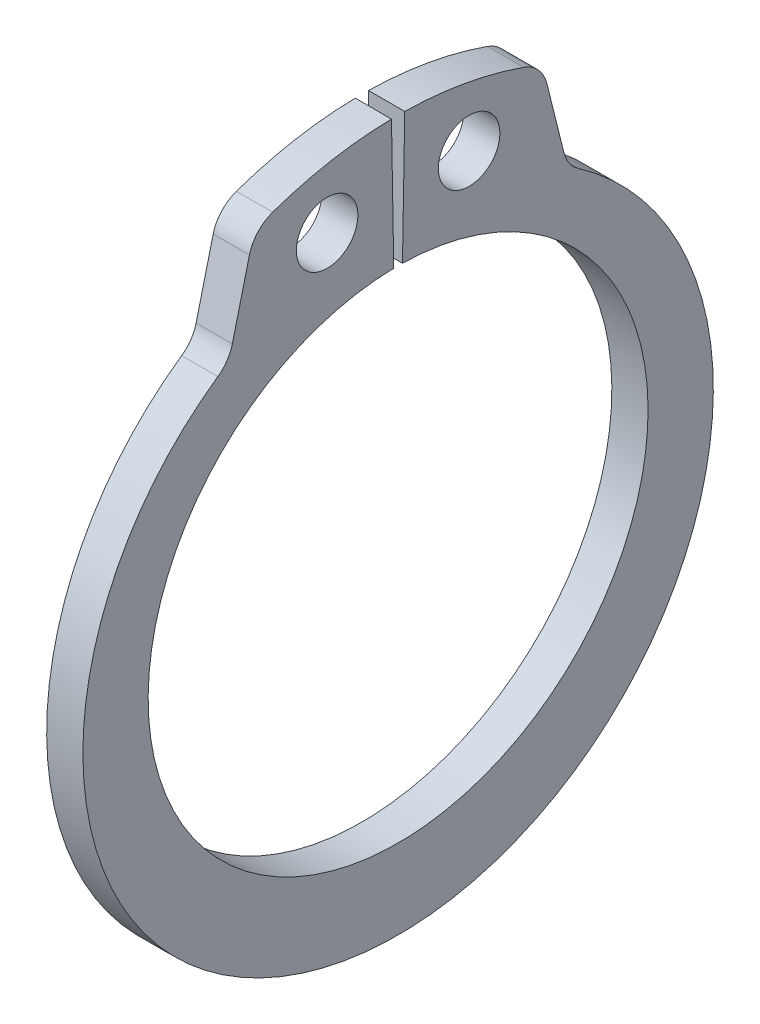
ISO-10303-21;
HEADER;
FILE_DESCRIPTION(('STEP AP214'),'2;1');
FILE_NAME('part.step','',(''),(''),'','','');
FILE_SCHEMA(('AUTOMOTIVE_DESIGN { 1 0 10303 214 1 1 1 1 }'));
ENDSEC;
DATA;
#1=APPLICATION_CONTEXT('core data for automotive mechanical design processes');
#2=APPLICATION_PROTOCOL_DEFINITION('international standard','automotive_design',2000,#1);
#3=PRODUCT_CONTEXT('',#1,'mechanical');
#4=PRODUCT('Part','Part','',(#3));
#5=PRODUCT_RELATED_PRODUCT_CATEGORY('part','',(#4));
#6=PRODUCT_DEFINITION_FORMATION('','',#4);
#7=PRODUCT_DEFINITION_CONTEXT('part definition',#1,'design');
#8=PRODUCT_DEFINITION('design','',#6,#7);
#9=PRODUCT_DEFINITION_SHAPE('','',#8);
#10=(LENGTH_UNIT() NAMED_UNIT(*) SI_UNIT(.MILLI.,.METRE.));
#11=(NAMED_UNIT(*) PLANE_ANGLE_UNIT() SI_UNIT($,.RADIAN.));
#12=(NAMED_UNIT(*) SI_UNIT($,.STERADIAN.) SOLID_ANGLE_UNIT());
#13=UNCERTAINTY_MEASURE_WITH_UNIT(LENGTH_MEASURE(1.E-05),#10,'distance_accuracy_value','');
#14=(GEOMETRIC_REPRESENTATION_CONTEXT(3) GLOBAL_UNCERTAINTY_ASSIGNED_CONTEXT((#13)) GLOBAL_UNIT_ASSIGNED_CONTEXT((#10,
#11,#12)) REPRESENTATION_CONTEXT('',''));
#15=CARTESIAN_POINT('',(0.,0.,0.));
#16=DIRECTION('',(0.,0.,1.));
#17=DIRECTION('',(1.,0.,0.));
#18=AXIS2_PLACEMENT_3D('',#15,#16,#17);
#19=CARTESIAN_POINT('',(0.5,0.,0.));
#20=DIRECTION('',(1.,0.,0.));
#21=DIRECTION('',(0.,0.,-1.));
#22=AXIS2_PLACEMENT_3D('',#19,#20,#21);
#23=PLANE('',#22);
#24=CARTESIAN_POINT('',(0.5,8.66711980549086,1.9596288316201));
#25=DIRECTION('',(1.,0.,0.));
#26=DIRECTION('',(0.,0.,-1.));
#27=AXIS2_PLACEMENT_3D('',#24,#25,#26);
#28=CIRCLE('',#27,0.85);
#29=CARTESIAN_POINT('',(0.5,8.66711980549086,1.1096288316201));
#30=VERTEX_POINT('',#29);
#31=EDGE_CURVE('E217',#30,#30,#28,.T.);
#32=ORIENTED_EDGE('',*,*,#31,.F.);
#33=EDGE_LOOP('',(#32));
#34=FACE_BOUND('',#33,.T.);
#35=CARTESIAN_POINT('',(0.5,0.,0.));
#36=DIRECTION('',(1.,0.,0.));
#37=DIRECTION('',(0.,0.,-1.));
#38=AXIS2_PLACEMENT_3D('',#35,#36,#37);
#39=CIRCLE('',#38,10.5);
#40=CARTESIAN_POINT('',(0.5,10.4984007991421,0.183250267591477));
#41=VERTEX_POINT('',#40);
#42=CARTESIAN_POINT('',(0.5,9.91217887924345,3.4639153953121));
#43=VERTEX_POINT('',#42);
#44=EDGE_CURVE('E134',#41,#43,#39,.T.);
#45=ORIENTED_EDGE('',*,*,#44,.T.);
#46=CARTESIAN_POINT('',(0.5,8.96816184312502,3.13401869099666));
#47=DIRECTION('',(1.,0.,0.));
#48=DIRECTION('',(0.,0.,-1.));
#49=AXIS2_PLACEMENT_3D('',#46,#47,#48);
#50=CIRCLE('',#49,1.);
#51=CARTESIAN_POINT('',(0.5,9.21008373872468,4.10431441727266));
#52=VERTEX_POINT('',#51);
#53=EDGE_CURVE('E171',#43,#52,#50,.T.);
#54=ORIENTED_EDGE('',*,*,#53,.T.);
#55=DIRECTION('',(0.,-0.970295726275997,0.241921895599665));
#56=VECTOR('',#55,1.);
#57=CARTESIAN_POINT('',(0.5,9.71734472745919,3.97784004803123));
#58=LINE('',#57,#56);
#59=CARTESIAN_POINT('',(0.5,7.31761530924591,4.57615979123836));
#60=VERTEX_POINT('',#59);
#61=EDGE_CURVE('E209',#52,#60,#58,.T.);
#62=ORIENTED_EDGE('',*,*,#61,.T.);
#63=CARTESIAN_POINT('',(0.5,7.55953720484557,5.54645551751436));
#64=DIRECTION('',(1.,0.,0.));
#65=DIRECTION('',(0.,0.,-1.));
#66=AXIS2_PLACEMENT_3D('',#63,#64,#65);
#67=CIRCLE('',#66,1.);
#68=CARTESIAN_POINT('',(0.5,6.73911195964233,4.97470170945254));
#69=VERTEX_POINT('',#68);
#70=EDGE_CURVE('E182',#60,#69,#67,.F.);
#71=ORIENTED_EDGE('',*,*,#70,.T.);
#72=CARTESIAN_POINT('',(0.5,-0.399224177769538,0.));
#73=DIRECTION('',(1.,0.,0.));
#74=DIRECTION('',(0.,0.,-1.));
#75=AXIS2_PLACEMENT_3D('',#72,#73,#74);
#76=CIRCLE('',#75,8.70077582223046);
#77=CARTESIAN_POINT('',(0.5,6.73911195964233,-4.97470170945253));
#78=VERTEX_POINT('',#77);
#79=EDGE_CURVE('E204',#69,#78,#76,.T.);
#80=ORIENTED_EDGE('',*,*,#79,.T.);
#81=CARTESIAN_POINT('',(0.5,7.55953720484557,-5.54645551751436));
#82=DIRECTION('',(1.,0.,0.));
#83=DIRECTION('',(0.,0.,-1.));
#84=AXIS2_PLACEMENT_3D('',#81,#82,#83);
#85=CIRCLE('',#84,1.);
#86=CARTESIAN_POINT('',(0.5,7.31761530924591,-4.57615979123836));
#87=VERTEX_POINT('',#86);
#88=EDGE_CURVE('E11',#78,#87,#85,.F.);
#89=ORIENTED_EDGE('',*,*,#88,.T.);
#90=DIRECTION('',(0.,0.970295726275997,0.241921895599664));
#91=VECTOR('',#90,1.);
#92=CARTESIAN_POINT('',(0.5,9.71734472745919,-3.97784004803123));
#93=LINE('',#92,#91);
#94=CARTESIAN_POINT('',(0.5,9.21008373872468,-4.10431441727266));
#95=VERTEX_POINT('',#94);
#96=EDGE_CURVE('E203',#87,#95,#93,.T.);
#97=ORIENTED_EDGE('',*,*,#96,.T.);
#98=CARTESIAN_POINT('',(0.5,8.96816184312502,-3.13401869099666));
#99=DIRECTION('',(1.,0.,0.));
#100=DIRECTION('',(0.,0.,-1.));
#101=AXIS2_PLACEMENT_3D('',#98,#99,#100);
#102=CIRCLE('',#101,1.);
#103=CARTESIAN_POINT('',(0.5,9.91217887924345,-3.4639153953121));
#104=VERTEX_POINT('',#103);
#105=EDGE_CURVE('E49',#95,#104,#102,.T.);
#106=ORIENTED_EDGE('',*,*,#105,.T.);
#107=CARTESIAN_POINT('',(0.5,0.,0.));
#108=DIRECTION('',(1.,0.,0.));
#109=DIRECTION('',(0.,0.,1.));
#110=AXIS2_PLACEMENT_3D('',#107,#108,#109);
#111=CIRCLE('',#110,10.5);
#112=CARTESIAN_POINT('',(0.5,10.4984007991421,-0.183250267591481));
#113=VERTEX_POINT('',#112);
#114=EDGE_CURVE('E206',#104,#113,#111,.T.);
#115=ORIENTED_EDGE('',*,*,#114,.T.);
#116=DIRECTION('',(0.,-0.999847695156391,0.0174524064372843));
#117=VECTOR('',#116,1.);
#118=CARTESIAN_POINT('',(0.5,10.4984007991421,-0.18325026759148));
#119=LINE('',#118,#117);
#120=CARTESIAN_POINT('',(0.5,6.8989490965791,-0.120421604417257));
#121=VERTEX_POINT('',#120);
#122=EDGE_CURVE('E140',#113,#121,#119,.T.);
#123=ORIENTED_EDGE('',*,*,#122,.T.);
#124=CARTESIAN_POINT('',(0.5,0.,0.));
#125=DIRECTION('',(-1.,0.,0.));
#126=DIRECTION('',(0.,0.,-1.));
#127=AXIS2_PLACEMENT_3D('',#124,#125,#126);
#128=CIRCLE('',#127,6.9);
#129=CARTESIAN_POINT('',(0.5,6.8989490965791,0.120421604417257));
#130=VERTEX_POINT('',#129);
#131=EDGE_CURVE('E135',#121,#130,#128,.T.);
#132=ORIENTED_EDGE('',*,*,#131,.T.);
#133=DIRECTION('',(0.,0.999847695156391,0.0174524064372835));
#134=VECTOR('',#133,1.);
#135=CARTESIAN_POINT('',(0.5,6.8989490965791,0.120421604417257));
#136=LINE('',#135,#134);
#137=EDGE_CURVE('E124',#130,#41,#136,.T.);
#138=ORIENTED_EDGE('',*,*,#137,.T.);
#139=EDGE_LOOP('',(#45,#54,#62,#71,#80,#89,#97,#106,#115,#123,#132,#138));
#140=FACE_BOUND('',#139,.T.);
#141=CARTESIAN_POINT('',(0.5,8.66711980549086,-1.9596288316201));
#142=DIRECTION('',(1.,0.,0.));
#143=DIRECTION('',(0.,0.,-1.));
#144=AXIS2_PLACEMENT_3D('',#141,#142,#143);
#145=CIRCLE('',#144,0.85);
#146=CARTESIAN_POINT('',(0.5,8.66711980549086,-2.8096288316201));
#147=VERTEX_POINT('',#146);
#148=EDGE_CURVE('E246',#147,#147,#145,.T.);
#149=ORIENTED_EDGE('',*,*,#148,.F.);
#150=EDGE_LOOP('',(#149));
#151=FACE_BOUND('',#150,.T.);
#152=ADVANCED_FACE('F34',(#34,#140,#151),#23,.T.);
#153=CARTESIAN_POINT('',(-0.5,0.,0.));
#154=DIRECTION('',(1.,0.,0.));
#155=DIRECTION('',(0.,0.,-1.));
#156=AXIS2_PLACEMENT_3D('',#153,#154,#155);
#157=PLANE('',#156);
#158=CARTESIAN_POINT('',(-0.5,8.66711980549086,1.9596288316201));
#159=DIRECTION('',(1.,0.,0.));
#160=DIRECTION('',(0.,0.,-1.));
#161=AXIS2_PLACEMENT_3D('',#158,#159,#160);
#162=CIRCLE('',#161,0.85);
#163=CARTESIAN_POINT('',(-0.5,8.66711980549086,1.1096288316201));
#164=VERTEX_POINT('',#163);
#165=EDGE_CURVE('E243',#164,#164,#162,.T.);
#166=ORIENTED_EDGE('',*,*,#165,.T.);
#167=EDGE_LOOP('',(#166));
#168=FACE_BOUND('',#167,.T.);
#169=DIRECTION('',(0.,-0.970295726275997,0.241921895599665));
#170=VECTOR('',#169,1.);
#171=CARTESIAN_POINT('',(-0.5,9.71734472745919,3.97784004803123));
#172=LINE('',#171,#170);
#173=CARTESIAN_POINT('',(-0.5,9.21008373872468,4.10431441727266));
#174=VERTEX_POINT('',#173);
#175=CARTESIAN_POINT('',(-0.5,7.31761530924591,4.57615979123836));
#176=VERTEX_POINT('',#175);
#177=EDGE_CURVE('E200',#174,#176,#172,.T.);
#178=ORIENTED_EDGE('',*,*,#177,.F.);
#179=CARTESIAN_POINT('',(-0.5,8.96816184312502,3.13401869099666));
#180=DIRECTION('',(1.,0.,0.));
#181=DIRECTION('',(0.,0.,-1.));
#182=AXIS2_PLACEMENT_3D('',#179,#180,#181);
#183=CIRCLE('',#182,1.);
#184=CARTESIAN_POINT('',(-0.5,9.91217887924345,3.4639153953121));
#185=VERTEX_POINT('',#184);
#186=EDGE_CURVE('E166',#174,#185,#183,.F.);
#187=ORIENTED_EDGE('',*,*,#186,.T.);
#188=CARTESIAN_POINT('',(-0.5,0.,0.));
#189=DIRECTION('',(1.,0.,0.));
#190=DIRECTION('',(0.,0.,-1.));
#191=AXIS2_PLACEMENT_3D('',#188,#189,#190);
#192=CIRCLE('',#191,10.5);
#193=CARTESIAN_POINT('',(-0.5,10.4984007991421,0.183250267591477));
#194=VERTEX_POINT('',#193);
#195=EDGE_CURVE('E219',#194,#185,#192,.T.);
#196=ORIENTED_EDGE('',*,*,#195,.F.);
#197=DIRECTION('',(0.,0.999847695156391,0.0174524064372835));
#198=VECTOR('',#197,1.);
#199=CARTESIAN_POINT('',(-0.5,6.8989490965791,0.120421604417257));
#200=LINE('',#199,#198);
#201=CARTESIAN_POINT('',(-0.5,6.8989490965791,0.120421604417257));
#202=VERTEX_POINT('',#201);
#203=EDGE_CURVE('E216',#202,#194,#200,.T.);
#204=ORIENTED_EDGE('',*,*,#203,.F.);
#205=CARTESIAN_POINT('',(-0.5,0.,0.));
#206=DIRECTION('',(-1.,0.,0.));
#207=DIRECTION('',(0.,0.,-1.));
#208=AXIS2_PLACEMENT_3D('',#205,#206,#207);
#209=CIRCLE('',#208,6.9);
#210=CARTESIAN_POINT('',(-0.5,6.8989490965791,-0.120421604417257));
#211=VERTEX_POINT('',#210);
#212=EDGE_CURVE('E148',#211,#202,#209,.T.);
#213=ORIENTED_EDGE('',*,*,#212,.F.);
#214=DIRECTION('',(0.,-0.999847695156391,0.0174524064372843));
#215=VECTOR('',#214,1.);
#216=CARTESIAN_POINT('',(-0.5,10.4984007991421,-0.18325026759148));
#217=LINE('',#216,#215);
#218=CARTESIAN_POINT('',(-0.5,10.4984007991421,-0.183250267591481));
#219=VERTEX_POINT('',#218);
#220=EDGE_CURVE('E144',#219,#211,#217,.T.);
#221=ORIENTED_EDGE('',*,*,#220,.F.);
#222=CARTESIAN_POINT('',(-0.5,0.,0.));
#223=DIRECTION('',(1.,0.,0.));
#224=DIRECTION('',(0.,0.,1.));
#225=AXIS2_PLACEMENT_3D('',#222,#223,#224);
#226=CIRCLE('',#225,10.5);
#227=CARTESIAN_POINT('',(-0.5,9.91217887924345,-3.4639153953121));
#228=VERTEX_POINT('',#227);
#229=EDGE_CURVE('E225',#228,#219,#226,.T.);
#230=ORIENTED_EDGE('',*,*,#229,.F.);
#231=CARTESIAN_POINT('',(-0.5,8.96816184312502,-3.13401869099666));
#232=DIRECTION('',(1.,0.,0.));
#233=DIRECTION('',(0.,0.,-1.));
#234=AXIS2_PLACEMENT_3D('',#231,#232,#233);
#235=CIRCLE('',#234,1.);
#236=CARTESIAN_POINT('',(-0.5,9.21008373872468,-4.10431441727266));
#237=VERTEX_POINT('',#236);
#238=EDGE_CURVE('E164',#228,#237,#235,.F.);
#239=ORIENTED_EDGE('',*,*,#238,.T.);
#240=DIRECTION('',(0.,0.970295726275997,0.241921895599664));
#241=VECTOR('',#240,1.);
#242=CARTESIAN_POINT('',(-0.5,9.71734472745919,-3.97784004803123));
#243=LINE('',#242,#241);
#244=CARTESIAN_POINT('',(-0.5,7.31761530924591,-4.57615979123836));
#245=VERTEX_POINT('',#244);
#246=EDGE_CURVE('E191',#245,#237,#243,.T.);
#247=ORIENTED_EDGE('',*,*,#246,.F.);
#248=CARTESIAN_POINT('',(-0.5,7.55953720484557,-5.54645551751436));
#249=DIRECTION('',(1.,0.,0.));
#250=DIRECTION('',(0.,0.,-1.));
#251=AXIS2_PLACEMENT_3D('',#248,#249,#250);
#252=CIRCLE('',#251,1.);
#253=CARTESIAN_POINT('',(-0.5,6.73911195964233,-4.97470170945253));
#254=VERTEX_POINT('',#253);
#255=EDGE_CURVE('E42',#245,#254,#252,.T.);
#256=ORIENTED_EDGE('',*,*,#255,.T.);
#257=CARTESIAN_POINT('',(-0.5,-0.399224177769538,0.));
#258=DIRECTION('',(1.,0.,0.));
#259=DIRECTION('',(0.,0.,-1.));
#260=AXIS2_PLACEMENT_3D('',#257,#258,#259);
#261=CIRCLE('',#260,8.70077582223046);
#262=CARTESIAN_POINT('',(-0.5,6.73911195964233,4.97470170945254));
#263=VERTEX_POINT('',#262);
#264=EDGE_CURVE('E190',#263,#254,#261,.T.);
#265=ORIENTED_EDGE('',*,*,#264,.F.);
#266=CARTESIAN_POINT('',(-0.5,7.55953720484557,5.54645551751436));
#267=DIRECTION('',(1.,0.,0.));
#268=DIRECTION('',(0.,0.,-1.));
#269=AXIS2_PLACEMENT_3D('',#266,#267,#268);
#270=CIRCLE('',#269,1.);
#271=EDGE_CURVE('E180',#263,#176,#270,.T.);
#272=ORIENTED_EDGE('',*,*,#271,.T.);
#273=EDGE_LOOP('',(#178,#187,#196,#204,#213,#221,#230,#239,#247,#256,#265,#272));
#274=FACE_BOUND('',#273,.T.);
#275=CARTESIAN_POINT('',(-0.5,8.66711980549086,-1.9596288316201));
#276=DIRECTION('',(1.,0.,0.));
#277=DIRECTION('',(0.,0.,-1.));
#278=AXIS2_PLACEMENT_3D('',#275,#276,#277);
#279=CIRCLE('',#278,0.85);
#280=CARTESIAN_POINT('',(-0.5,8.66711980549086,-2.8096288316201));
#281=VERTEX_POINT('',#280);
#282=EDGE_CURVE('E249',#281,#281,#279,.T.);
#283=ORIENTED_EDGE('',*,*,#282,.T.);
#284=EDGE_LOOP('',(#283));
#285=FACE_BOUND('',#284,.T.);
#286=ADVANCED_FACE('F188',(#168,#274,#285),#157,.F.);
#287=CARTESIAN_POINT('',(0.5,0.,0.));
#288=DIRECTION('',(-1.,0.,0.));
#289=DIRECTION('',(0.,0.,1.));
#290=AXIS2_PLACEMENT_3D('',#287,#288,#289);
#291=CYLINDRICAL_SURFACE('',#290,6.9);
#292=ORIENTED_EDGE('',*,*,#212,.T.);
#293=DIRECTION('',(-1.,0.,0.));
#294=VECTOR('',#293,1.);
#295=CARTESIAN_POINT('',(0.5,6.8989490965791,0.120421604417257));
#296=LINE('',#295,#294);
#297=EDGE_CURVE('E128',#130,#202,#296,.T.);
#298=ORIENTED_EDGE('',*,*,#297,.F.);
#299=ORIENTED_EDGE('',*,*,#131,.F.);
#300=DIRECTION('',(-1.,0.,0.));
#301=VECTOR('',#300,1.);
#302=CARTESIAN_POINT('',(0.5,6.8989490965791,-0.120421604417257));
#303=LINE('',#302,#301);
#304=EDGE_CURVE('E214',#121,#211,#303,.T.);
#305=ORIENTED_EDGE('',*,*,#304,.T.);
#306=EDGE_LOOP('',(#292,#298,#299,#305));
#307=FACE_BOUND('',#306,.T.);
#308=ADVANCED_FACE('F146',(#307),#291,.F.);
#309=CARTESIAN_POINT('',(0.5,6.8989490965791,0.120421604417257));
#310=DIRECTION('',(0.,-0.0174524064372835,0.999847695156391));
#311=DIRECTION('',(0.,-0.999847695156391,-0.0174524064372835));
#312=AXIS2_PLACEMENT_3D('',#309,#310,#311);
#313=PLANE('',#312);
#314=ORIENTED_EDGE('',*,*,#203,.T.);
#315=DIRECTION('',(-1.,0.,0.));
#316=VECTOR('',#315,1.);
#317=CARTESIAN_POINT('',(0.5,10.4984007991421,0.183250267591477));
#318=LINE('',#317,#316);
#319=EDGE_CURVE('E131',#41,#194,#318,.T.);
#320=ORIENTED_EDGE('',*,*,#319,.F.);
#321=ORIENTED_EDGE('',*,*,#137,.F.);
#322=ORIENTED_EDGE('',*,*,#297,.T.);
#323=EDGE_LOOP('',(#314,#320,#321,#322));
#324=FACE_BOUND('',#323,.T.);
#325=ADVANCED_FACE('F126',(#324),#313,.F.);
#326=CARTESIAN_POINT('',(0.5,0.,0.));
#327=DIRECTION('',(-1.,0.,0.));
#328=DIRECTION('',(0.,0.,1.));
#329=AXIS2_PLACEMENT_3D('',#326,#327,#328);
#330=CYLINDRICAL_SURFACE('',#329,10.5);
#331=ORIENTED_EDGE('',*,*,#195,.T.);
#332=DIRECTION('',(-1.,0.,0.));
#333=VECTOR('',#332,1.);
#334=CARTESIAN_POINT('',(0.5,9.91217887924345,3.4639153953121));
#335=LINE('',#334,#333);
#336=EDGE_CURVE('E168',#185,#43,#335,.F.);
#337=ORIENTED_EDGE('',*,*,#336,.T.);
#338=ORIENTED_EDGE('',*,*,#44,.F.);
#339=ORIENTED_EDGE('',*,*,#319,.T.);
#340=EDGE_LOOP('',(#331,#337,#338,#339));
#341=FACE_BOUND('',#340,.T.);
#342=ADVANCED_FACE('F237',(#341),#330,.T.);
#343=CARTESIAN_POINT('',(0.5,9.71734472745919,3.97784004803123));
#344=DIRECTION('',(0.,-0.241921895599665,-0.970295726275997));
#345=DIRECTION('',(0.,0.970295726275997,-0.241921895599665));
#346=AXIS2_PLACEMENT_3D('',#343,#344,#345);
#347=PLANE('',#346);
#348=ORIENTED_EDGE('',*,*,#177,.T.);
#349=DIRECTION('',(1.,0.,0.));
#350=VECTOR('',#349,1.);
#351=CARTESIAN_POINT('',(0.5,7.31761530924591,4.57615979123836));
#352=LINE('',#351,#350);
#353=EDGE_CURVE('E162',#176,#60,#352,.T.);
#354=ORIENTED_EDGE('',*,*,#353,.T.);
#355=ORIENTED_EDGE('',*,*,#61,.F.);
#356=DIRECTION('',(-1.,0.,0.));
#357=VECTOR('',#356,1.);
#358=CARTESIAN_POINT('',(0.5,9.21008373872468,4.10431441727266));
#359=LINE('',#358,#357);
#360=EDGE_CURVE('E159',#52,#174,#359,.T.);
#361=ORIENTED_EDGE('',*,*,#360,.T.);
#362=EDGE_LOOP('',(#348,#354,#355,#361));
#363=FACE_BOUND('',#362,.T.);
#364=ADVANCED_FACE('F279',(#363),#347,.F.);
#365=CARTESIAN_POINT('',(0.5,-0.399224177769538,0.));
#366=DIRECTION('',(-1.,0.,0.));
#367=DIRECTION('',(0.,0.,1.));
#368=AXIS2_PLACEMENT_3D('',#365,#366,#367);
#369=CYLINDRICAL_SURFACE('',#368,8.70077582223046);
#370=ORIENTED_EDGE('',*,*,#79,.F.);
#371=DIRECTION('',(-1.,0.,0.));
#372=VECTOR('',#371,1.);
#373=CARTESIAN_POINT('',(0.5,6.73911195964233,4.97470170945254));
#374=LINE('',#373,#372);
#375=EDGE_CURVE('E151',#69,#263,#374,.T.);
#376=ORIENTED_EDGE('',*,*,#375,.T.);
#377=ORIENTED_EDGE('',*,*,#264,.T.);
#378=DIRECTION('',(-1.,0.,0.));
#379=VECTOR('',#378,1.);
#380=CARTESIAN_POINT('',(0.5,6.73911195964233,-4.97470170945254));
#381=LINE('',#380,#379);
#382=EDGE_CURVE('E149',#254,#78,#381,.F.);
#383=ORIENTED_EDGE('',*,*,#382,.T.);
#384=EDGE_LOOP('',(#370,#376,#377,#383));
#385=FACE_BOUND('',#384,.T.);
#386=ADVANCED_FACE('F197',(#385),#369,.T.);
#387=CARTESIAN_POINT('',(0.5,9.71734472745919,-3.97784004803123));
#388=DIRECTION('',(0.,-0.241921895599664,0.970295726275997));
#389=DIRECTION('',(0.,-0.970295726275997,-0.241921895599664));
#390=AXIS2_PLACEMENT_3D('',#387,#388,#389);
#391=PLANE('',#390);
#392=ORIENTED_EDGE('',*,*,#246,.T.);
#393=DIRECTION('',(-1.,0.,0.));
#394=VECTOR('',#393,1.);
#395=CARTESIAN_POINT('',(0.5,9.21008373872468,-4.10431441727266));
#396=LINE('',#395,#394);
#397=EDGE_CURVE('E57',#237,#95,#396,.F.);
#398=ORIENTED_EDGE('',*,*,#397,.T.);
#399=ORIENTED_EDGE('',*,*,#96,.F.);
#400=DIRECTION('',(1.,0.,0.));
#401=VECTOR('',#400,1.);
#402=CARTESIAN_POINT('',(-0.5,7.31761530924591,-4.57615979123836));
#403=LINE('',#402,#401);
#404=EDGE_CURVE('E176',#87,#245,#403,.F.);
#405=ORIENTED_EDGE('',*,*,#404,.T.);
#406=EDGE_LOOP('',(#392,#398,#399,#405));
#407=FACE_BOUND('',#406,.T.);
#408=ADVANCED_FACE('F205',(#407),#391,.F.);
#409=CARTESIAN_POINT('',(0.5,0.,0.));
#410=DIRECTION('',(-1.,0.,0.));
#411=DIRECTION('',(0.,0.,1.));
#412=AXIS2_PLACEMENT_3D('',#409,#410,#411);
#413=CYLINDRICAL_SURFACE('',#412,10.5);
#414=ORIENTED_EDGE('',*,*,#114,.F.);
#415=DIRECTION('',(-1.,0.,0.));
#416=VECTOR('',#415,1.);
#417=CARTESIAN_POINT('',(0.5,9.91217887924345,-3.4639153953121));
#418=LINE('',#417,#416);
#419=EDGE_CURVE('E173',#104,#228,#418,.T.);
#420=ORIENTED_EDGE('',*,*,#419,.T.);
#421=ORIENTED_EDGE('',*,*,#229,.T.);
#422=DIRECTION('',(-1.,0.,0.));
#423=VECTOR('',#422,1.);
#424=CARTESIAN_POINT('',(0.5,10.4984007991421,-0.183250267591481));
#425=LINE('',#424,#423);
#426=EDGE_CURVE('E153',#113,#219,#425,.T.);
#427=ORIENTED_EDGE('',*,*,#426,.F.);
#428=EDGE_LOOP('',(#414,#420,#421,#427));
#429=FACE_BOUND('',#428,.T.);
#430=ADVANCED_FACE('F272',(#429),#413,.T.);
#431=CARTESIAN_POINT('',(0.5,10.4984007991421,-0.18325026759148));
#432=DIRECTION('',(0.,-0.0174524064372843,-0.999847695156391));
#433=DIRECTION('',(0.,0.999847695156391,-0.0174524064372843));
#434=AXIS2_PLACEMENT_3D('',#431,#432,#433);
#435=PLANE('',#434);
#436=ORIENTED_EDGE('',*,*,#220,.T.);
#437=ORIENTED_EDGE('',*,*,#304,.F.);
#438=ORIENTED_EDGE('',*,*,#122,.F.);
#439=ORIENTED_EDGE('',*,*,#426,.T.);
#440=EDGE_LOOP('',(#436,#437,#438,#439));
#441=FACE_BOUND('',#440,.T.);
#442=ADVANCED_FACE('F232',(#441),#435,.F.);
#443=CARTESIAN_POINT('',(0.5,8.66711980549086,1.9596288316201));
#444=DIRECTION('',(-1.,0.,0.));
#445=DIRECTION('',(0.,0.,1.));
#446=AXIS2_PLACEMENT_3D('',#443,#444,#445);
#447=CYLINDRICAL_SURFACE('',#446,0.85);
#448=ORIENTED_EDGE('',*,*,#31,.T.);
#449=EDGE_LOOP('',(#448));
#450=FACE_BOUND('',#449,.T.);
#451=ORIENTED_EDGE('',*,*,#165,.F.);
#452=EDGE_LOOP('',(#451));
#453=FACE_BOUND('',#452,.T.);
#454=ADVANCED_FACE('F267',(#450,#453),#447,.F.);
#455=CARTESIAN_POINT('',(0.5,8.66711980549086,-1.9596288316201));
#456=DIRECTION('',(-1.,0.,0.));
#457=DIRECTION('',(0.,0.,1.));
#458=AXIS2_PLACEMENT_3D('',#455,#456,#457);
#459=CYLINDRICAL_SURFACE('',#458,0.85);
#460=ORIENTED_EDGE('',*,*,#148,.T.);
#461=EDGE_LOOP('',(#460));
#462=FACE_BOUND('',#461,.T.);
#463=ORIENTED_EDGE('',*,*,#282,.F.);
#464=EDGE_LOOP('',(#463));
#465=FACE_BOUND('',#464,.T.);
#466=ADVANCED_FACE('F255',(#462,#465),#459,.F.);
#467=CARTESIAN_POINT('',(0.5,7.55953720484557,5.54645551751436));
#468=DIRECTION('',(-1.,0.,0.));
#469=DIRECTION('',(0.,0.,1.));
#470=AXIS2_PLACEMENT_3D('',#467,#468,#469);
#471=CYLINDRICAL_SURFACE('',#470,1.);
#472=ORIENTED_EDGE('',*,*,#70,.F.);
#473=ORIENTED_EDGE('',*,*,#353,.F.);
#474=ORIENTED_EDGE('',*,*,#271,.F.);
#475=ORIENTED_EDGE('',*,*,#375,.F.);
#476=EDGE_LOOP('',(#472,#473,#474,#475));
#477=FACE_BOUND('',#476,.T.);
#478=ADVANCED_FACE('F289',(#477),#471,.F.);
#479=CARTESIAN_POINT('',(0.5,8.96816184312502,3.13401869099666));
#480=DIRECTION('',(-1.,0.,0.));
#481=DIRECTION('',(0.,0.,1.));
#482=AXIS2_PLACEMENT_3D('',#479,#480,#481);
#483=CYLINDRICAL_SURFACE('',#482,1.);
#484=ORIENTED_EDGE('',*,*,#53,.F.);
#485=ORIENTED_EDGE('',*,*,#336,.F.);
#486=ORIENTED_EDGE('',*,*,#186,.F.);
#487=ORIENTED_EDGE('',*,*,#360,.F.);
#488=EDGE_LOOP('',(#484,#485,#486,#487));
#489=FACE_BOUND('',#488,.T.);
#490=ADVANCED_FACE('F292',(#489),#483,.T.);
#491=CARTESIAN_POINT('',(0.5,8.96816184312502,-3.13401869099666));
#492=DIRECTION('',(-1.,0.,0.));
#493=DIRECTION('',(0.,0.,1.));
#494=AXIS2_PLACEMENT_3D('',#491,#492,#493);
#495=CYLINDRICAL_SURFACE('',#494,1.);
#496=ORIENTED_EDGE('',*,*,#105,.F.);
#497=ORIENTED_EDGE('',*,*,#397,.F.);
#498=ORIENTED_EDGE('',*,*,#238,.F.);
#499=ORIENTED_EDGE('',*,*,#419,.F.);
#500=EDGE_LOOP('',(#496,#497,#498,#499));
#501=FACE_BOUND('',#500,.T.);
#502=ADVANCED_FACE('F295',(#501),#495,.T.);
#503=CARTESIAN_POINT('',(0.5,7.55953720484557,-5.54645551751436));
#504=DIRECTION('',(-1.,0.,0.));
#505=DIRECTION('',(0.,0.,1.));
#506=AXIS2_PLACEMENT_3D('',#503,#504,#505);
#507=CYLINDRICAL_SURFACE('',#506,1.);
#508=ORIENTED_EDGE('',*,*,#88,.F.);
#509=ORIENTED_EDGE('',*,*,#382,.F.);
#510=ORIENTED_EDGE('',*,*,#255,.F.);
#511=ORIENTED_EDGE('',*,*,#404,.F.);
#512=EDGE_LOOP('',(#508,#509,#510,#511));
#513=FACE_BOUND('',#512,.T.);
#514=ADVANCED_FACE('F36',(#513),#507,.F.);
#515=CLOSED_SHELL('',(#152,#286,#308,#325,#342,#364,#386,#408,#430,#442,#454,#466,#478,#490,
#502,#514));
#516=MANIFOLD_SOLID_BREP('B2',#515);
#517=ADVANCED_BREP_SHAPE_REPRESENTATION('',(#18,#516),#14);
#518=SHAPE_DEFINITION_REPRESENTATION(#9,#517);
ENDSEC;
END-ISO-10303-21;
